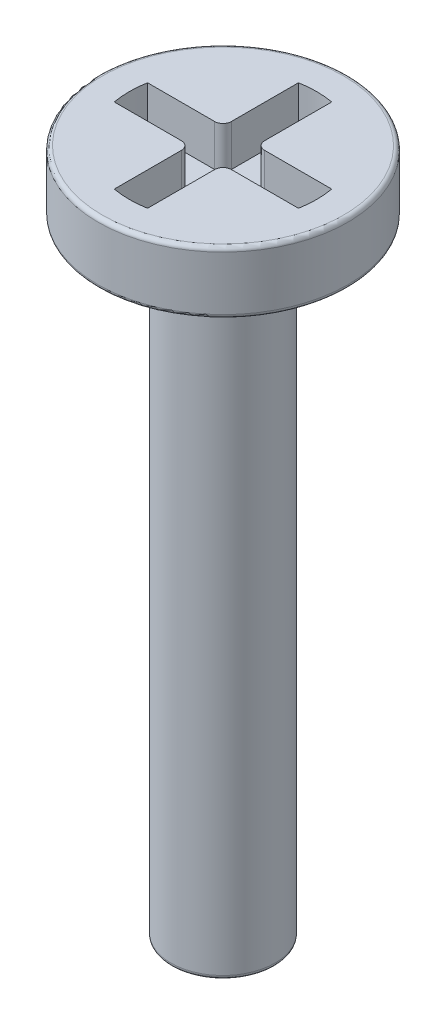
ISO-10303-21;
HEADER;
FILE_DESCRIPTION(('STEP AP214'),'2;1');
FILE_NAME('part.step','',(''),(''),'','','');
FILE_SCHEMA(('AUTOMOTIVE_DESIGN { 1 0 10303 214 1 1 1 1 }'));
ENDSEC;
DATA;
#1=APPLICATION_CONTEXT('core data for automotive mechanical design processes');
#2=APPLICATION_PROTOCOL_DEFINITION('international standard','automotive_design',2000,#1);
#3=PRODUCT_CONTEXT('',#1,'mechanical');
#4=PRODUCT('Part','Part','',(#3));
#5=PRODUCT_RELATED_PRODUCT_CATEGORY('part','',(#4));
#6=PRODUCT_DEFINITION_FORMATION('','',#4);
#7=PRODUCT_DEFINITION_CONTEXT('part definition',#1,'design');
#8=PRODUCT_DEFINITION('design','',#6,#7);
#9=PRODUCT_DEFINITION_SHAPE('','',#8);
#10=(LENGTH_UNIT() NAMED_UNIT(*) SI_UNIT(.MILLI.,.METRE.));
#11=(NAMED_UNIT(*) PLANE_ANGLE_UNIT() SI_UNIT($,.RADIAN.));
#12=(NAMED_UNIT(*) SI_UNIT($,.STERADIAN.) SOLID_ANGLE_UNIT());
#13=UNCERTAINTY_MEASURE_WITH_UNIT(LENGTH_MEASURE(1.E-05),#10,'distance_accuracy_value','');
#14=(GEOMETRIC_REPRESENTATION_CONTEXT(3) GLOBAL_UNCERTAINTY_ASSIGNED_CONTEXT((#13)) GLOBAL_UNIT_ASSIGNED_CONTEXT((#10,
#11,#12)) REPRESENTATION_CONTEXT('',''));
#15=CARTESIAN_POINT('',(0.,0.,0.));
#16=DIRECTION('',(0.,0.,1.));
#17=DIRECTION('',(1.,0.,0.));
#18=AXIS2_PLACEMENT_3D('',#15,#16,#17);
#19=CARTESIAN_POINT('',(0.,0.,0.));
#20=DIRECTION('',(0.,1.,0.));
#21=DIRECTION('',(0.,0.,1.));
#22=AXIS2_PLACEMENT_3D('',#19,#20,#21);
#23=PLANE('',#22);
#24=CARTESIAN_POINT('',(0.,0.,0.));
#25=DIRECTION('',(0.,1.,0.));
#26=DIRECTION('',(0.,0.,1.));
#27=AXIS2_PLACEMENT_3D('',#24,#25,#26);
#28=CIRCLE('',#27,2.25);
#29=CARTESIAN_POINT('',(0.399999999999998,0.,-2.21415898254845));
#30=VERTEX_POINT('',#29);
#31=CARTESIAN_POINT('',(-0.399999999999998,0.,-2.21415898254845));
#32=VERTEX_POINT('',#31);
#33=EDGE_CURVE('E47',#30,#32,#28,.T.);
#34=ORIENTED_EDGE('',*,*,#33,.F.);
#35=DIRECTION('',(0.,0.,-1.));
#36=VECTOR('',#35,1.);
#37=CARTESIAN_POINT('',(0.399999999999998,0.,-2.21415898254845));
#38=LINE('',#37,#36);
#39=CARTESIAN_POINT('',(0.399999999999998,0.,-0.600000000000003));
#40=VERTEX_POINT('',#39);
#41=EDGE_CURVE('E220',#40,#30,#38,.T.);
#42=ORIENTED_EDGE('',*,*,#41,.F.);
#43=CARTESIAN_POINT('',(0.600000000000003,0.,-0.599999999999974));
#44=DIRECTION('',(0.,-1.,0.));
#45=DIRECTION('',(0.,0.,-1.));
#46=AXIS2_PLACEMENT_3D('',#43,#44,#45);
#47=CIRCLE('',#46,0.2);
#48=CARTESIAN_POINT('',(0.599999999999989,0.,-0.399999999999975));
#49=VERTEX_POINT('',#48);
#50=EDGE_CURVE('E218',#49,#40,#47,.T.);
#51=ORIENTED_EDGE('',*,*,#50,.F.);
#52=DIRECTION('',(-1.,0.,0.));
#53=VECTOR('',#52,1.);
#54=CARTESIAN_POINT('',(0.599999999999989,0.,-0.399999999999975));
#55=LINE('',#54,#53);
#56=CARTESIAN_POINT('',(2.21415898254845,0.,-0.400000000000003));
#57=VERTEX_POINT('',#56);
#58=EDGE_CURVE('E155',#57,#49,#55,.T.);
#59=ORIENTED_EDGE('',*,*,#58,.F.);
#60=CARTESIAN_POINT('',(0.,0.,0.));
#61=DIRECTION('',(0.,1.,0.));
#62=DIRECTION('',(0.,0.,1.));
#63=AXIS2_PLACEMENT_3D('',#60,#61,#62);
#64=CIRCLE('',#63,2.25);
#65=CARTESIAN_POINT('',(2.21415898254845,0.,0.399999999999999));
#66=VERTEX_POINT('',#65);
#67=EDGE_CURVE('E214',#66,#57,#64,.T.);
#68=ORIENTED_EDGE('',*,*,#67,.F.);
#69=DIRECTION('',(1.,0.,0.));
#70=VECTOR('',#69,1.);
#71=CARTESIAN_POINT('',(0.600000000000003,0.,0.400000000000027));
#72=LINE('',#71,#70);
#73=CARTESIAN_POINT('',(0.600000000000003,0.,0.400000000000027));
#74=VERTEX_POINT('',#73);
#75=EDGE_CURVE('E211',#74,#66,#72,.T.);
#76=ORIENTED_EDGE('',*,*,#75,.F.);
#77=CARTESIAN_POINT('',(0.600000000000003,0.,0.600000000000026));
#78=DIRECTION('',(0.,-1.,0.));
#79=DIRECTION('',(0.,0.,-1.));
#80=AXIS2_PLACEMENT_3D('',#77,#78,#79);
#81=CIRCLE('',#80,0.2);
#82=CARTESIAN_POINT('',(0.400000000000011,0.,0.600000000000003));
#83=VERTEX_POINT('',#82);
#84=EDGE_CURVE('E208',#83,#74,#81,.T.);
#85=ORIENTED_EDGE('',*,*,#84,.F.);
#86=DIRECTION('',(0.,0.,-1.));
#87=VECTOR('',#86,1.);
#88=CARTESIAN_POINT('',(0.400000000000011,0.,0.600000000000003));
#89=LINE('',#88,#87);
#90=CARTESIAN_POINT('',(0.399999999999998,0.,2.21415898254845));
#91=VERTEX_POINT('',#90);
#92=EDGE_CURVE('E205',#91,#83,#89,.T.);
#93=ORIENTED_EDGE('',*,*,#92,.F.);
#94=CARTESIAN_POINT('',(0.,0.,0.));
#95=DIRECTION('',(0.,1.,0.));
#96=DIRECTION('',(0.,0.,1.));
#97=AXIS2_PLACEMENT_3D('',#94,#95,#96);
#98=CIRCLE('',#97,2.25);
#99=CARTESIAN_POINT('',(-0.399999999999998,0.,2.21415898254845));
#100=VERTEX_POINT('',#99);
#101=EDGE_CURVE('E202',#100,#91,#98,.T.);
#102=ORIENTED_EDGE('',*,*,#101,.F.);
#103=DIRECTION('',(0.,0.,1.));
#104=VECTOR('',#103,1.);
#105=CARTESIAN_POINT('',(-0.399999999999998,0.,0.600000000000005));
#106=LINE('',#105,#104);
#107=CARTESIAN_POINT('',(-0.399999999999998,0.,0.600000000000005));
#108=VERTEX_POINT('',#107);
#109=EDGE_CURVE('E199',#108,#100,#106,.T.);
#110=ORIENTED_EDGE('',*,*,#109,.F.);
#111=CARTESIAN_POINT('',(-0.599999999999989,0.,0.600000000000003));
#112=DIRECTION('',(0.,-1.,0.));
#113=DIRECTION('',(0.,0.,-1.));
#114=AXIS2_PLACEMENT_3D('',#111,#112,#113);
#115=CIRCLE('',#114,0.2);
#116=CARTESIAN_POINT('',(-0.599999999999989,0.,0.400000000000005));
#117=VERTEX_POINT('',#116);
#118=EDGE_CURVE('E196',#117,#108,#115,.T.);
#119=ORIENTED_EDGE('',*,*,#118,.F.);
#120=DIRECTION('',(1.,0.,0.));
#121=VECTOR('',#120,1.);
#122=CARTESIAN_POINT('',(-2.21415898254845,0.,0.399999999999996));
#123=LINE('',#122,#121);
#124=CARTESIAN_POINT('',(-2.21415898254845,0.,0.399999999999996));
#125=VERTEX_POINT('',#124);
#126=EDGE_CURVE('E193',#125,#117,#123,.T.);
#127=ORIENTED_EDGE('',*,*,#126,.F.);
#128=CARTESIAN_POINT('',(0.,0.,0.));
#129=DIRECTION('',(0.,1.,0.));
#130=DIRECTION('',(0.,0.,1.));
#131=AXIS2_PLACEMENT_3D('',#128,#129,#130);
#132=CIRCLE('',#131,2.25);
#133=CARTESIAN_POINT('',(-2.21415898254845,0.,-0.399999999999999));
#134=VERTEX_POINT('',#133);
#135=EDGE_CURVE('E190',#134,#125,#132,.T.);
#136=ORIENTED_EDGE('',*,*,#135,.F.);
#137=DIRECTION('',(-1.,0.,0.));
#138=VECTOR('',#137,1.);
#139=CARTESIAN_POINT('',(-2.21415898254845,0.,-0.399999999999999));
#140=LINE('',#139,#138);
#141=CARTESIAN_POINT('',(-0.600000000000003,0.,-0.399999999999998));
#142=VERTEX_POINT('',#141);
#143=EDGE_CURVE('E187',#142,#134,#140,.T.);
#144=ORIENTED_EDGE('',*,*,#143,.F.);
#145=CARTESIAN_POINT('',(-0.600000000000003,0.,-0.599999999999996));
#146=DIRECTION('',(0.,-1.,0.));
#147=DIRECTION('',(0.,0.,-1.));
#148=AXIS2_PLACEMENT_3D('',#145,#146,#147);
#149=CIRCLE('',#148,0.2);
#150=CARTESIAN_POINT('',(-0.399999999999998,0.,-0.600000000000002));
#151=VERTEX_POINT('',#150);
#152=EDGE_CURVE('E184',#151,#142,#149,.T.);
#153=ORIENTED_EDGE('',*,*,#152,.F.);
#154=DIRECTION('',(0.,0.,1.));
#155=VECTOR('',#154,1.);
#156=CARTESIAN_POINT('',(-0.399999999999998,0.,-2.21415898254845));
#157=LINE('',#156,#155);
#158=EDGE_CURVE('E181',#32,#151,#157,.T.);
#159=ORIENTED_EDGE('',*,*,#158,.F.);
#160=EDGE_LOOP('',(#34,#42,#51,#59,#68,#76,#85,#93,#102,#110,#119,#127,#136,#144,#153,#159));
#161=FACE_BOUND('',#160,.T.);
#162=CARTESIAN_POINT('',(0.,0.,0.));
#163=DIRECTION('',(0.,1.,0.));
#164=DIRECTION('',(0.,0.,1.));
#165=AXIS2_PLACEMENT_3D('',#162,#163,#164);
#166=CIRCLE('',#165,2.9);
#167=CARTESIAN_POINT('',(0.,0.,2.9));
#168=VERTEX_POINT('',#167);
#169=EDGE_CURVE('E258',#168,#168,#166,.T.);
#170=ORIENTED_EDGE('',*,*,#169,.T.);
#171=EDGE_LOOP('',(#170));
#172=FACE_BOUND('',#171,.T.);
#173=ADVANCED_FACE('F32',(#161,#172),#23,.T.);
#174=CARTESIAN_POINT('',(0.,14.9128552678076,0.));
#175=DIRECTION('',(0.,1.,0.));
#176=DIRECTION('',(0.,0.,1.));
#177=AXIS2_PLACEMENT_3D('',#174,#175,#176);
#178=CYLINDRICAL_SURFACE('',#177,3.);
#179=CARTESIAN_POINT('',(0.,-0.100000000000003,0.));
#180=DIRECTION('',(0.,1.,0.));
#181=DIRECTION('',(0.,0.,1.));
#182=AXIS2_PLACEMENT_3D('',#179,#180,#181);
#183=CIRCLE('',#182,3.);
#184=CARTESIAN_POINT('',(0.,-0.100000000000003,3.00000000000001));
#185=VERTEX_POINT('',#184);
#186=EDGE_CURVE('E40',#185,#185,#183,.F.);
#187=ORIENTED_EDGE('',*,*,#186,.T.);
#188=EDGE_LOOP('',(#187));
#189=FACE_BOUND('',#188,.T.);
#190=CARTESIAN_POINT('',(0.,-1.4,0.));
#191=DIRECTION('',(0.,-1.,0.));
#192=DIRECTION('',(0.,0.,-1.));
#193=AXIS2_PLACEMENT_3D('',#190,#191,#192);
#194=CIRCLE('',#193,3.);
#195=CARTESIAN_POINT('',(0.,-1.4,-3.));
#196=VERTEX_POINT('',#195);
#197=EDGE_CURVE('E261',#196,#196,#194,.F.);
#198=ORIENTED_EDGE('',*,*,#197,.T.);
#199=EDGE_LOOP('',(#198));
#200=FACE_BOUND('',#199,.T.);
#201=ADVANCED_FACE('F266',(#189,#200),#178,.T.);
#202=CARTESIAN_POINT('',(-2.99999999999999,-1.5,0.));
#203=DIRECTION('',(0.,-1.,0.));
#204=DIRECTION('',(0.,0.,-1.));
#205=AXIS2_PLACEMENT_3D('',#202,#203,#204);
#206=PLANE('',#205);
#207=CARTESIAN_POINT('',(0.,-1.5,0.));
#208=DIRECTION('',(0.,-1.,0.));
#209=DIRECTION('',(0.,0.,-1.));
#210=AXIS2_PLACEMENT_3D('',#207,#208,#209);
#211=CIRCLE('',#210,2.9);
#212=CARTESIAN_POINT('',(0.,-1.5,-2.9));
#213=VERTEX_POINT('',#212);
#214=EDGE_CURVE('E11',#213,#213,#211,.T.);
#215=ORIENTED_EDGE('',*,*,#214,.T.);
#216=EDGE_LOOP('',(#215));
#217=FACE_BOUND('',#216,.T.);
#218=CARTESIAN_POINT('',(0.,-1.5,0.));
#219=DIRECTION('',(0.,1.,0.));
#220=DIRECTION('',(0.,0.,1.));
#221=AXIS2_PLACEMENT_3D('',#218,#219,#220);
#222=CIRCLE('',#221,1.25);
#223=CARTESIAN_POINT('',(0.,-1.5,1.25));
#224=VERTEX_POINT('',#223);
#225=EDGE_CURVE('E224',#224,#224,#222,.T.);
#226=ORIENTED_EDGE('',*,*,#225,.T.);
#227=EDGE_LOOP('',(#226));
#228=FACE_BOUND('',#227,.T.);
#229=ADVANCED_FACE('F281',(#217,#228),#206,.T.);
#230=CARTESIAN_POINT('',(0.,14.9128552678076,0.));
#231=DIRECTION('',(0.,1.,0.));
#232=DIRECTION('',(0.,0.,1.));
#233=AXIS2_PLACEMENT_3D('',#230,#231,#232);
#234=CYLINDRICAL_SURFACE('',#233,1.25);
#235=CARTESIAN_POINT('',(0.,-16.4,0.));
#236=DIRECTION('',(0.,-1.,0.));
#237=DIRECTION('',(0.,0.,-1.));
#238=AXIS2_PLACEMENT_3D('',#235,#236,#237);
#239=CIRCLE('',#238,1.25);
#240=CARTESIAN_POINT('',(0.,-16.4,-1.25));
#241=VERTEX_POINT('',#240);
#242=EDGE_CURVE('E252',#241,#241,#239,.F.);
#243=ORIENTED_EDGE('',*,*,#242,.T.);
#244=EDGE_LOOP('',(#243));
#245=FACE_BOUND('',#244,.T.);
#246=ORIENTED_EDGE('',*,*,#225,.F.);
#247=EDGE_LOOP('',(#246));
#248=FACE_BOUND('',#247,.T.);
#249=ADVANCED_FACE('F291',(#245,#248),#234,.T.);
#250=CARTESIAN_POINT('',(-1.24999999999999,-16.5,0.));
#251=DIRECTION('',(0.,-1.,0.));
#252=DIRECTION('',(0.,0.,-1.));
#253=AXIS2_PLACEMENT_3D('',#250,#251,#252);
#254=PLANE('',#253);
#255=CARTESIAN_POINT('',(0.,-16.5,0.));
#256=DIRECTION('',(0.,-1.,0.));
#257=DIRECTION('',(0.,0.,-1.));
#258=AXIS2_PLACEMENT_3D('',#255,#256,#257);
#259=CIRCLE('',#258,1.15);
#260=CARTESIAN_POINT('',(0.,-16.5,-1.14999999999999));
#261=VERTEX_POINT('',#260);
#262=EDGE_CURVE('E255',#261,#261,#259,.T.);
#263=ORIENTED_EDGE('',*,*,#262,.T.);
#264=EDGE_LOOP('',(#263));
#265=FACE_BOUND('',#264,.T.);
#266=ADVANCED_FACE('F286',(#265),#254,.T.);
#267=CARTESIAN_POINT('',(0.,-16.4,0.));
#268=DIRECTION('',(0.,-1.,0.));
#269=DIRECTION('',(0.,0.,-1.));
#270=AXIS2_PLACEMENT_3D('',#267,#268,#269);
#271=TOROIDAL_SURFACE('',#270,1.15,0.1);
#272=ORIENTED_EDGE('',*,*,#262,.F.);
#273=EDGE_LOOP('',(#272));
#274=FACE_BOUND('',#273,.T.);
#275=ORIENTED_EDGE('',*,*,#242,.F.);
#276=EDGE_LOOP('',(#275));
#277=FACE_BOUND('',#276,.T.);
#278=ADVANCED_FACE('F272',(#274,#277),#271,.T.);
#279=CARTESIAN_POINT('',(0.,-0.100000000000003,0.));
#280=DIRECTION('',(0.,1.,0.));
#281=DIRECTION('',(0.,0.,1.));
#282=AXIS2_PLACEMENT_3D('',#279,#280,#281);
#283=TOROIDAL_SURFACE('',#282,2.9,0.1);
#284=ORIENTED_EDGE('',*,*,#186,.F.);
#285=EDGE_LOOP('',(#284));
#286=FACE_BOUND('',#285,.T.);
#287=ORIENTED_EDGE('',*,*,#169,.F.);
#288=EDGE_LOOP('',(#287));
#289=FACE_BOUND('',#288,.T.);
#290=ADVANCED_FACE('F269',(#286,#289),#283,.T.);
#291=CARTESIAN_POINT('',(0.,-1.4,0.));
#292=DIRECTION('',(0.,-1.,0.));
#293=DIRECTION('',(0.,0.,-1.));
#294=AXIS2_PLACEMENT_3D('',#291,#292,#293);
#295=TOROIDAL_SURFACE('',#294,2.9,0.1);
#296=ORIENTED_EDGE('',*,*,#214,.F.);
#297=EDGE_LOOP('',(#296));
#298=FACE_BOUND('',#297,.T.);
#299=ORIENTED_EDGE('',*,*,#197,.F.);
#300=EDGE_LOOP('',(#299));
#301=FACE_BOUND('',#300,.T.);
#302=ADVANCED_FACE('F34',(#298,#301),#295,.T.);
#303=CARTESIAN_POINT('',(0.,-1.,0.));
#304=DIRECTION('',(0.,1.,0.));
#305=DIRECTION('',(0.,0.,1.));
#306=AXIS2_PLACEMENT_3D('',#303,#304,#305);
#307=CYLINDRICAL_SURFACE('',#306,2.25);
#308=ORIENTED_EDGE('',*,*,#33,.T.);
#309=DIRECTION('',(0.,1.,0.));
#310=VECTOR('',#309,1.);
#311=CARTESIAN_POINT('',(-0.399999999999998,-0.999999999999952,-2.21415898254845));
#312=LINE('',#311,#310);
#313=CARTESIAN_POINT('',(-0.399999999999998,-0.999999999999952,-2.21415898254845));
#314=VERTEX_POINT('',#313);
#315=EDGE_CURVE('E107',#314,#32,#312,.T.);
#316=ORIENTED_EDGE('',*,*,#315,.F.);
#317=CARTESIAN_POINT('',(0.,-1.,0.));
#318=DIRECTION('',(0.,1.,0.));
#319=DIRECTION('',(0.,0.,1.));
#320=AXIS2_PLACEMENT_3D('',#317,#318,#319);
#321=CIRCLE('',#320,2.25);
#322=CARTESIAN_POINT('',(0.399999999999998,-0.999999999999952,-2.21415898254848));
#323=VERTEX_POINT('',#322);
#324=EDGE_CURVE('E222',#323,#314,#321,.T.);
#325=ORIENTED_EDGE('',*,*,#324,.F.);
#326=DIRECTION('',(0.,1.,0.));
#327=VECTOR('',#326,1.);
#328=CARTESIAN_POINT('',(0.399999999999998,-0.999999999999952,-2.21415898254848));
#329=LINE('',#328,#327);
#330=EDGE_CURVE('E55',#323,#30,#329,.T.);
#331=ORIENTED_EDGE('',*,*,#330,.T.);
#332=EDGE_LOOP('',(#308,#316,#325,#331));
#333=FACE_BOUND('',#332,.T.);
#334=ADVANCED_FACE('F308',(#333),#307,.F.);
#335=CARTESIAN_POINT('',(0.399999999999998,-0.999999999999952,-2.21415898254848));
#336=DIRECTION('',(1.,0.,0.));
#337=DIRECTION('',(0.,0.,-1.));
#338=AXIS2_PLACEMENT_3D('',#335,#336,#337);
#339=PLANE('',#338);
#340=ORIENTED_EDGE('',*,*,#41,.T.);
#341=ORIENTED_EDGE('',*,*,#330,.F.);
#342=DIRECTION('',(0.,0.,-1.));
#343=VECTOR('',#342,1.);
#344=CARTESIAN_POINT('',(0.399999999999998,-0.999999999999952,-2.21415898254848));
#345=LINE('',#344,#343);
#346=CARTESIAN_POINT('',(0.399999999999998,-1.,-0.600000000000024));
#347=VERTEX_POINT('',#346);
#348=EDGE_CURVE('E167',#347,#323,#345,.T.);
#349=ORIENTED_EDGE('',*,*,#348,.F.);
#350=DIRECTION('',(0.,1.,0.));
#351=VECTOR('',#350,1.);
#352=CARTESIAN_POINT('',(0.399999999999998,-1.,-0.600000000000024));
#353=LINE('',#352,#351);
#354=EDGE_CURVE('E159',#347,#40,#353,.T.);
#355=ORIENTED_EDGE('',*,*,#354,.T.);
#356=EDGE_LOOP('',(#340,#341,#349,#355));
#357=FACE_BOUND('',#356,.T.);
#358=ADVANCED_FACE('F311',(#357),#339,.F.);
#359=CARTESIAN_POINT('',(0.600000000000003,-1.,-0.599999999999995));
#360=DIRECTION('',(0.,1.,0.));
#361=DIRECTION('',(0.,0.,1.));
#362=AXIS2_PLACEMENT_3D('',#359,#360,#361);
#363=CYLINDRICAL_SURFACE('',#362,0.2);
#364=ORIENTED_EDGE('',*,*,#50,.T.);
#365=ORIENTED_EDGE('',*,*,#354,.F.);
#366=CARTESIAN_POINT('',(0.600000000000003,-1.,-0.599999999999995));
#367=DIRECTION('',(0.,-1.,0.));
#368=DIRECTION('',(0.,0.,-1.));
#369=AXIS2_PLACEMENT_3D('',#366,#367,#368);
#370=CIRCLE('',#369,0.2);
#371=CARTESIAN_POINT('',(0.599999999999989,-1.00000000000002,-0.399999999999996));
#372=VERTEX_POINT('',#371);
#373=EDGE_CURVE('E163',#372,#347,#370,.T.);
#374=ORIENTED_EDGE('',*,*,#373,.F.);
#375=DIRECTION('',(0.,1.,0.));
#376=VECTOR('',#375,1.);
#377=CARTESIAN_POINT('',(0.599999999999989,-1.00000000000002,-0.399999999999996));
#378=LINE('',#377,#376);
#379=EDGE_CURVE('E148',#372,#49,#378,.T.);
#380=ORIENTED_EDGE('',*,*,#379,.T.);
#381=EDGE_LOOP('',(#364,#365,#374,#380));
#382=FACE_BOUND('',#381,.T.);
#383=ADVANCED_FACE('F164',(#382),#363,.T.);
#384=CARTESIAN_POINT('',(0.599999999999989,-1.00000000000002,-0.399999999999996));
#385=DIRECTION('',(0.,0.,-1.));
#386=DIRECTION('',(-1.,0.,0.));
#387=AXIS2_PLACEMENT_3D('',#384,#385,#386);
#388=PLANE('',#387);
#389=ORIENTED_EDGE('',*,*,#58,.T.);
#390=ORIENTED_EDGE('',*,*,#379,.F.);
#391=DIRECTION('',(-1.,0.,0.));
#392=VECTOR('',#391,1.);
#393=CARTESIAN_POINT('',(0.599999999999989,-1.00000000000002,-0.399999999999996));
#394=LINE('',#393,#392);
#395=CARTESIAN_POINT('',(2.21415898254845,-1.00000000000002,-0.400000000000003));
#396=VERTEX_POINT('',#395);
#397=EDGE_CURVE('E152',#396,#372,#394,.T.);
#398=ORIENTED_EDGE('',*,*,#397,.F.);
#399=DIRECTION('',(0.,1.,0.));
#400=VECTOR('',#399,1.);
#401=CARTESIAN_POINT('',(2.21415898254845,-1.00000000000002,-0.400000000000003));
#402=LINE('',#401,#400);
#403=EDGE_CURVE('E160',#396,#57,#402,.T.);
#404=ORIENTED_EDGE('',*,*,#403,.T.);
#405=EDGE_LOOP('',(#389,#390,#398,#404));
#406=FACE_BOUND('',#405,.T.);
#407=ADVANCED_FACE('F150',(#406),#388,.F.);
#408=CARTESIAN_POINT('',(0.,-1.,0.));
#409=DIRECTION('',(0.,1.,0.));
#410=DIRECTION('',(0.,0.,1.));
#411=AXIS2_PLACEMENT_3D('',#408,#409,#410);
#412=CYLINDRICAL_SURFACE('',#411,2.25);
#413=ORIENTED_EDGE('',*,*,#67,.T.);
#414=ORIENTED_EDGE('',*,*,#403,.F.);
#415=CARTESIAN_POINT('',(0.,-1.,0.));
#416=DIRECTION('',(0.,1.,0.));
#417=DIRECTION('',(0.,0.,1.));
#418=AXIS2_PLACEMENT_3D('',#415,#416,#417);
#419=CIRCLE('',#418,2.25);
#420=CARTESIAN_POINT('',(2.21415898254845,-0.999999999999952,0.399999999999999));
#421=VERTEX_POINT('',#420);
#422=EDGE_CURVE('E173',#421,#396,#419,.T.);
#423=ORIENTED_EDGE('',*,*,#422,.F.);
#424=DIRECTION('',(0.,1.,0.));
#425=VECTOR('',#424,1.);
#426=CARTESIAN_POINT('',(2.21415898254845,-0.999999999999952,0.399999999999999));
#427=LINE('',#426,#425);
#428=EDGE_CURVE('E227',#421,#66,#427,.T.);
#429=ORIENTED_EDGE('',*,*,#428,.T.);
#430=EDGE_LOOP('',(#413,#414,#423,#429));
#431=FACE_BOUND('',#430,.T.);
#432=ADVANCED_FACE('F355',(#431),#412,.F.);
#433=CARTESIAN_POINT('',(0.600000000000003,-0.999999999999952,0.399999999999999));
#434=DIRECTION('',(0.,0.,1.));
#435=DIRECTION('',(1.,0.,0.));
#436=AXIS2_PLACEMENT_3D('',#433,#434,#435);
#437=PLANE('',#436);
#438=ORIENTED_EDGE('',*,*,#75,.T.);
#439=ORIENTED_EDGE('',*,*,#428,.F.);
#440=DIRECTION('',(1.,0.,0.));
#441=VECTOR('',#440,1.);
#442=CARTESIAN_POINT('',(0.600000000000003,-0.999999999999952,0.399999999999999));
#443=LINE('',#442,#441);
#444=CARTESIAN_POINT('',(0.600000000000003,-0.999999999999952,0.399999999999999));
#445=VERTEX_POINT('',#444);
#446=EDGE_CURVE('E175',#445,#421,#443,.T.);
#447=ORIENTED_EDGE('',*,*,#446,.F.);
#448=DIRECTION('',(0.,1.,0.));
#449=VECTOR('',#448,1.);
#450=CARTESIAN_POINT('',(0.600000000000003,-0.999999999999952,0.399999999999999));
#451=LINE('',#450,#449);
#452=EDGE_CURVE('E229',#445,#74,#451,.T.);
#453=ORIENTED_EDGE('',*,*,#452,.T.);
#454=EDGE_LOOP('',(#438,#439,#447,#453));
#455=FACE_BOUND('',#454,.T.);
#456=ADVANCED_FACE('F351',(#455),#437,.F.);
#457=CARTESIAN_POINT('',(0.600000000000003,-1.,0.600000000000005));
#458=DIRECTION('',(0.,1.,0.));
#459=DIRECTION('',(0.,0.,1.));
#460=AXIS2_PLACEMENT_3D('',#457,#458,#459);
#461=CYLINDRICAL_SURFACE('',#460,0.2);
#462=ORIENTED_EDGE('',*,*,#84,.T.);
#463=ORIENTED_EDGE('',*,*,#452,.F.);
#464=CARTESIAN_POINT('',(0.600000000000003,-1.,0.600000000000005));
#465=DIRECTION('',(0.,-1.,0.));
#466=DIRECTION('',(0.,0.,-1.));
#467=AXIS2_PLACEMENT_3D('',#464,#465,#466);
#468=CIRCLE('',#467,0.2);
#469=CARTESIAN_POINT('',(0.400000000000011,-1.,0.599999999999976));
#470=VERTEX_POINT('',#469);
#471=EDGE_CURVE('E550',#470,#445,#468,.T.);
#472=ORIENTED_EDGE('',*,*,#471,.F.);
#473=DIRECTION('',(0.,1.,0.));
#474=VECTOR('',#473,1.);
#475=CARTESIAN_POINT('',(0.400000000000011,-1.,0.599999999999976));
#476=LINE('',#475,#474);
#477=EDGE_CURVE('E231',#470,#83,#476,.T.);
#478=ORIENTED_EDGE('',*,*,#477,.T.);
#479=EDGE_LOOP('',(#462,#463,#472,#478));
#480=FACE_BOUND('',#479,.T.);
#481=ADVANCED_FACE('F347',(#480),#461,.T.);
#482=CARTESIAN_POINT('',(0.400000000000011,-1.,0.599999999999976));
#483=DIRECTION('',(1.,0.,0.));
#484=DIRECTION('',(0.,0.,-1.));
#485=AXIS2_PLACEMENT_3D('',#482,#483,#484);
#486=PLANE('',#485);
#487=ORIENTED_EDGE('',*,*,#92,.T.);
#488=ORIENTED_EDGE('',*,*,#477,.F.);
#489=DIRECTION('',(0.,0.,-1.));
#490=VECTOR('',#489,1.);
#491=CARTESIAN_POINT('',(0.400000000000011,-1.,0.599999999999976));
#492=LINE('',#491,#490);
#493=CARTESIAN_POINT('',(0.399999999999998,-1.00000000000003,2.21415898254843));
#494=VERTEX_POINT('',#493);
#495=EDGE_CURVE('E547',#494,#470,#492,.T.);
#496=ORIENTED_EDGE('',*,*,#495,.F.);
#497=DIRECTION('',(0.,1.,0.));
#498=VECTOR('',#497,1.);
#499=CARTESIAN_POINT('',(0.399999999999998,-1.00000000000003,2.21415898254843));
#500=LINE('',#499,#498);
#501=EDGE_CURVE('E233',#494,#91,#500,.T.);
#502=ORIENTED_EDGE('',*,*,#501,.T.);
#503=EDGE_LOOP('',(#487,#488,#496,#502));
#504=FACE_BOUND('',#503,.T.);
#505=ADVANCED_FACE('F343',(#504),#486,.F.);
#506=CARTESIAN_POINT('',(0.,-1.,0.));
#507=DIRECTION('',(0.,1.,0.));
#508=DIRECTION('',(0.,0.,1.));
#509=AXIS2_PLACEMENT_3D('',#506,#507,#508);
#510=CYLINDRICAL_SURFACE('',#509,2.25);
#511=ORIENTED_EDGE('',*,*,#101,.T.);
#512=ORIENTED_EDGE('',*,*,#501,.F.);
#513=CARTESIAN_POINT('',(0.,-1.,0.));
#514=DIRECTION('',(0.,1.,0.));
#515=DIRECTION('',(0.,0.,1.));
#516=AXIS2_PLACEMENT_3D('',#513,#514,#515);
#517=CIRCLE('',#516,2.25);
#518=CARTESIAN_POINT('',(-0.399999999999998,-1.00000000000003,2.21415898254845));
#519=VERTEX_POINT('',#518);
#520=EDGE_CURVE('E544',#519,#494,#517,.T.);
#521=ORIENTED_EDGE('',*,*,#520,.F.);
#522=DIRECTION('',(0.,1.,0.));
#523=VECTOR('',#522,1.);
#524=CARTESIAN_POINT('',(-0.399999999999998,-1.00000000000003,2.21415898254845));
#525=LINE('',#524,#523);
#526=EDGE_CURVE('E235',#519,#100,#525,.T.);
#527=ORIENTED_EDGE('',*,*,#526,.T.);
#528=EDGE_LOOP('',(#511,#512,#521,#527));
#529=FACE_BOUND('',#528,.T.);
#530=ADVANCED_FACE('F339',(#529),#510,.F.);
#531=CARTESIAN_POINT('',(-0.399999999999998,-1.,0.599999999999998));
#532=DIRECTION('',(-1.,0.,0.));
#533=DIRECTION('',(0.,0.,1.));
#534=AXIS2_PLACEMENT_3D('',#531,#532,#533);
#535=PLANE('',#534);
#536=ORIENTED_EDGE('',*,*,#109,.T.);
#537=ORIENTED_EDGE('',*,*,#526,.F.);
#538=DIRECTION('',(0.,0.,1.));
#539=VECTOR('',#538,1.);
#540=CARTESIAN_POINT('',(-0.399999999999998,-1.,0.599999999999998));
#541=LINE('',#540,#539);
#542=CARTESIAN_POINT('',(-0.399999999999998,-1.,0.599999999999998));
#543=VERTEX_POINT('',#542);
#544=EDGE_CURVE('E541',#543,#519,#541,.T.);
#545=ORIENTED_EDGE('',*,*,#544,.F.);
#546=DIRECTION('',(0.,1.,0.));
#547=VECTOR('',#546,1.);
#548=CARTESIAN_POINT('',(-0.399999999999998,-1.,0.599999999999998));
#549=LINE('',#548,#547);
#550=EDGE_CURVE('E237',#543,#108,#549,.T.);
#551=ORIENTED_EDGE('',*,*,#550,.T.);
#552=EDGE_LOOP('',(#536,#537,#545,#551));
#553=FACE_BOUND('',#552,.T.);
#554=ADVANCED_FACE('F335',(#553),#535,.F.);
#555=CARTESIAN_POINT('',(-0.599999999999989,-1.,0.599999999999996));
#556=DIRECTION('',(0.,1.,0.));
#557=DIRECTION('',(0.,0.,1.));
#558=AXIS2_PLACEMENT_3D('',#555,#556,#557);
#559=CYLINDRICAL_SURFACE('',#558,0.2);
#560=ORIENTED_EDGE('',*,*,#118,.T.);
#561=ORIENTED_EDGE('',*,*,#550,.F.);
#562=CARTESIAN_POINT('',(-0.599999999999989,-1.,0.599999999999996));
#563=DIRECTION('',(0.,-1.,0.));
#564=DIRECTION('',(0.,0.,-1.));
#565=AXIS2_PLACEMENT_3D('',#562,#563,#564);
#566=CIRCLE('',#565,0.2);
#567=CARTESIAN_POINT('',(-0.599999999999989,-0.999999999999952,0.399999999999998));
#568=VERTEX_POINT('',#567);
#569=EDGE_CURVE('E538',#568,#543,#566,.T.);
#570=ORIENTED_EDGE('',*,*,#569,.F.);
#571=DIRECTION('',(0.,1.,0.));
#572=VECTOR('',#571,1.);
#573=CARTESIAN_POINT('',(-0.599999999999989,-0.999999999999952,0.399999999999998));
#574=LINE('',#573,#572);
#575=EDGE_CURVE('E239',#568,#117,#574,.T.);
#576=ORIENTED_EDGE('',*,*,#575,.T.);
#577=EDGE_LOOP('',(#560,#561,#570,#576));
#578=FACE_BOUND('',#577,.T.);
#579=ADVANCED_FACE('F331',(#578),#559,.T.);
#580=CARTESIAN_POINT('',(-2.21415898254845,-0.999999999999952,0.399999999999996));
#581=DIRECTION('',(0.,0.,1.));
#582=DIRECTION('',(1.,0.,0.));
#583=AXIS2_PLACEMENT_3D('',#580,#581,#582);
#584=PLANE('',#583);
#585=ORIENTED_EDGE('',*,*,#126,.T.);
#586=ORIENTED_EDGE('',*,*,#575,.F.);
#587=DIRECTION('',(1.,0.,0.));
#588=VECTOR('',#587,1.);
#589=CARTESIAN_POINT('',(-2.21415898254845,-0.999999999999952,0.399999999999996));
#590=LINE('',#589,#588);
#591=CARTESIAN_POINT('',(-2.21415898254845,-0.999999999999952,0.399999999999996));
#592=VERTEX_POINT('',#591);
#593=EDGE_CURVE('E535',#592,#568,#590,.T.);
#594=ORIENTED_EDGE('',*,*,#593,.F.);
#595=DIRECTION('',(0.,1.,0.));
#596=VECTOR('',#595,1.);
#597=CARTESIAN_POINT('',(-2.21415898254845,-0.999999999999952,0.399999999999996));
#598=LINE('',#597,#596);
#599=EDGE_CURVE('E241',#592,#125,#598,.T.);
#600=ORIENTED_EDGE('',*,*,#599,.T.);
#601=EDGE_LOOP('',(#585,#586,#594,#600));
#602=FACE_BOUND('',#601,.T.);
#603=ADVANCED_FACE('F327',(#602),#584,.F.);
#604=CARTESIAN_POINT('',(0.,-1.,0.));
#605=DIRECTION('',(0.,1.,0.));
#606=DIRECTION('',(0.,0.,1.));
#607=AXIS2_PLACEMENT_3D('',#604,#605,#606);
#608=CYLINDRICAL_SURFACE('',#607,2.25);
#609=ORIENTED_EDGE('',*,*,#135,.T.);
#610=ORIENTED_EDGE('',*,*,#599,.F.);
#611=CARTESIAN_POINT('',(0.,-1.,0.));
#612=DIRECTION('',(0.,1.,0.));
#613=DIRECTION('',(0.,0.,1.));
#614=AXIS2_PLACEMENT_3D('',#611,#612,#613);
#615=CIRCLE('',#614,2.25);
#616=CARTESIAN_POINT('',(-2.21415898254845,-1.00000000000002,-0.400000000000006));
#617=VERTEX_POINT('',#616);
#618=EDGE_CURVE('E532',#617,#592,#615,.T.);
#619=ORIENTED_EDGE('',*,*,#618,.F.);
#620=DIRECTION('',(0.,1.,0.));
#621=VECTOR('',#620,1.);
#622=CARTESIAN_POINT('',(-2.21415898254845,-1.00000000000002,-0.400000000000006));
#623=LINE('',#622,#621);
#624=EDGE_CURVE('E243',#617,#134,#623,.T.);
#625=ORIENTED_EDGE('',*,*,#624,.T.);
#626=EDGE_LOOP('',(#609,#610,#619,#625));
#627=FACE_BOUND('',#626,.T.);
#628=ADVANCED_FACE('F323',(#627),#608,.F.);
#629=CARTESIAN_POINT('',(-2.21415898254845,-1.00000000000002,-0.400000000000006));
#630=DIRECTION('',(0.,0.,-1.));
#631=DIRECTION('',(-1.,0.,0.));
#632=AXIS2_PLACEMENT_3D('',#629,#630,#631);
#633=PLANE('',#632);
#634=ORIENTED_EDGE('',*,*,#143,.T.);
#635=ORIENTED_EDGE('',*,*,#624,.F.);
#636=DIRECTION('',(-1.,0.,0.));
#637=VECTOR('',#636,1.);
#638=CARTESIAN_POINT('',(-2.21415898254845,-1.00000000000002,-0.400000000000006));
#639=LINE('',#638,#637);
#640=CARTESIAN_POINT('',(-0.600000000000003,-1.00000000000002,-0.399999999999998));
#641=VERTEX_POINT('',#640);
#642=EDGE_CURVE('E529',#641,#617,#639,.T.);
#643=ORIENTED_EDGE('',*,*,#642,.F.);
#644=DIRECTION('',(0.,1.,0.));
#645=VECTOR('',#644,1.);
#646=CARTESIAN_POINT('',(-0.600000000000003,-1.00000000000002,-0.399999999999998));
#647=LINE('',#646,#645);
#648=EDGE_CURVE('E245',#641,#142,#647,.T.);
#649=ORIENTED_EDGE('',*,*,#648,.T.);
#650=EDGE_LOOP('',(#634,#635,#643,#649));
#651=FACE_BOUND('',#650,.T.);
#652=ADVANCED_FACE('F319',(#651),#633,.F.);
#653=CARTESIAN_POINT('',(-0.600000000000003,-1.,-0.600000000000003));
#654=DIRECTION('',(0.,1.,0.));
#655=DIRECTION('',(0.,0.,1.));
#656=AXIS2_PLACEMENT_3D('',#653,#654,#655);
#657=CYLINDRICAL_SURFACE('',#656,0.2);
#658=ORIENTED_EDGE('',*,*,#152,.T.);
#659=ORIENTED_EDGE('',*,*,#648,.F.);
#660=CARTESIAN_POINT('',(-0.600000000000003,-1.,-0.600000000000003));
#661=DIRECTION('',(0.,-1.,0.));
#662=DIRECTION('',(0.,0.,-1.));
#663=AXIS2_PLACEMENT_3D('',#660,#661,#662);
#664=CIRCLE('',#663,0.2);
#665=CARTESIAN_POINT('',(-0.399999999999998,-1.,-0.600000000000002));
#666=VERTEX_POINT('',#665);
#667=EDGE_CURVE('E524',#666,#641,#664,.T.);
#668=ORIENTED_EDGE('',*,*,#667,.F.);
#669=DIRECTION('',(0.,1.,0.));
#670=VECTOR('',#669,1.);
#671=CARTESIAN_POINT('',(-0.399999999999998,-1.,-0.600000000000002));
#672=LINE('',#671,#670);
#673=EDGE_CURVE('E247',#666,#151,#672,.T.);
#674=ORIENTED_EDGE('',*,*,#673,.T.);
#675=EDGE_LOOP('',(#658,#659,#668,#674));
#676=FACE_BOUND('',#675,.T.);
#677=ADVANCED_FACE('F315',(#676),#657,.T.);
#678=CARTESIAN_POINT('',(-0.399999999999998,-0.999999999999952,-2.21415898254845));
#679=DIRECTION('',(-1.,0.,0.));
#680=DIRECTION('',(0.,0.,1.));
#681=AXIS2_PLACEMENT_3D('',#678,#679,#680);
#682=PLANE('',#681);
#683=ORIENTED_EDGE('',*,*,#158,.T.);
#684=ORIENTED_EDGE('',*,*,#673,.F.);
#685=DIRECTION('',(0.,0.,1.));
#686=VECTOR('',#685,1.);
#687=CARTESIAN_POINT('',(-0.399999999999998,-0.999999999999952,-2.21415898254845));
#688=LINE('',#687,#686);
#689=EDGE_CURVE('E522',#314,#666,#688,.T.);
#690=ORIENTED_EDGE('',*,*,#689,.F.);
#691=ORIENTED_EDGE('',*,*,#315,.T.);
#692=EDGE_LOOP('',(#683,#684,#690,#691));
#693=FACE_BOUND('',#692,.T.);
#694=ADVANCED_FACE('F312',(#693),#682,.F.);
#695=CARTESIAN_POINT('',(0.,-1.,0.));
#696=DIRECTION('',(0.,1.,0.));
#697=DIRECTION('',(0.,0.,1.));
#698=AXIS2_PLACEMENT_3D('',#695,#696,#697);
#699=PLANE('',#698);
#700=ORIENTED_EDGE('',*,*,#324,.T.);
#701=ORIENTED_EDGE('',*,*,#689,.T.);
#702=ORIENTED_EDGE('',*,*,#667,.T.);
#703=ORIENTED_EDGE('',*,*,#642,.T.);
#704=ORIENTED_EDGE('',*,*,#618,.T.);
#705=ORIENTED_EDGE('',*,*,#593,.T.);
#706=ORIENTED_EDGE('',*,*,#569,.T.);
#707=ORIENTED_EDGE('',*,*,#544,.T.);
#708=ORIENTED_EDGE('',*,*,#520,.T.);
#709=ORIENTED_EDGE('',*,*,#495,.T.);
#710=ORIENTED_EDGE('',*,*,#471,.T.);
#711=ORIENTED_EDGE('',*,*,#446,.T.);
#712=ORIENTED_EDGE('',*,*,#422,.T.);
#713=ORIENTED_EDGE('',*,*,#397,.T.);
#714=ORIENTED_EDGE('',*,*,#373,.T.);
#715=ORIENTED_EDGE('',*,*,#348,.T.);
#716=EDGE_LOOP('',(#700,#701,#702,#703,#704,#705,#706,#707,#708,#709,#710,#711,#712,#713,#714,#715));
#717=FACE_BOUND('',#716,.T.);
#718=ADVANCED_FACE('F170',(#717),#699,.T.);
#719=CLOSED_SHELL('',(#173,#201,#229,#249,#266,#278,#290,#302,#334,#358,#383,#407,#432,#456,
#481,#505,#530,#554,#579,#603,#628,#652,#677,#694,#718));
#720=MANIFOLD_SOLID_BREP('B2',#719);
#721=ADVANCED_BREP_SHAPE_REPRESENTATION('',(#18,#720),#14);
#722=SHAPE_DEFINITION_REPRESENTATION(#9,#721);
ENDSEC;
END-ISO-10303-21;
